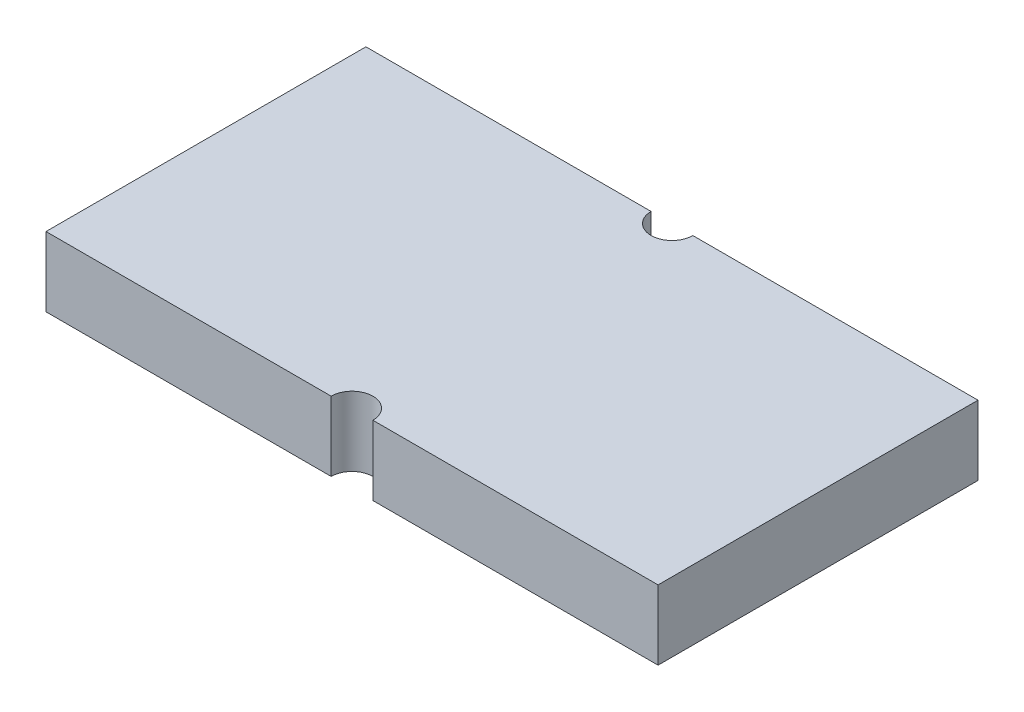
ISO-10303-21;
HEADER;
FILE_DESCRIPTION(('STEP AP214'),'2;1');
FILE_NAME('part.step','',(''),(''),'','','');
FILE_SCHEMA(('AUTOMOTIVE_DESIGN { 1 0 10303 214 1 1 1 1 }'));
ENDSEC;
DATA;
#1=APPLICATION_CONTEXT('core data for automotive mechanical design processes');
#2=APPLICATION_PROTOCOL_DEFINITION('international standard','automotive_design',2000,#1);
#3=PRODUCT_CONTEXT('',#1,'mechanical');
#4=PRODUCT('Part','Part','',(#3));
#5=PRODUCT_RELATED_PRODUCT_CATEGORY('part','',(#4));
#6=PRODUCT_DEFINITION_FORMATION('','',#4);
#7=PRODUCT_DEFINITION_CONTEXT('part definition',#1,'design');
#8=PRODUCT_DEFINITION('design','',#6,#7);
#9=PRODUCT_DEFINITION_SHAPE('','',#8);
#10=(LENGTH_UNIT() NAMED_UNIT(*) SI_UNIT(.MILLI.,.METRE.));
#11=(NAMED_UNIT(*) PLANE_ANGLE_UNIT() SI_UNIT($,.RADIAN.));
#12=(NAMED_UNIT(*) SI_UNIT($,.STERADIAN.) SOLID_ANGLE_UNIT());
#13=UNCERTAINTY_MEASURE_WITH_UNIT(LENGTH_MEASURE(1.E-05),#10,'distance_accuracy_value','');
#14=(GEOMETRIC_REPRESENTATION_CONTEXT(3) GLOBAL_UNCERTAINTY_ASSIGNED_CONTEXT((#13)) GLOBAL_UNIT_ASSIGNED_CONTEXT((#10,
#11,#12)) REPRESENTATION_CONTEXT('',''));
#15=CARTESIAN_POINT('',(0.,0.,0.));
#16=DIRECTION('',(0.,0.,1.));
#17=DIRECTION('',(1.,0.,0.));
#18=AXIS2_PLACEMENT_3D('',#15,#16,#17);
#19=CARTESIAN_POINT('',(-22.,5.,-11.5));
#20=DIRECTION('',(0.,0.,1.));
#21=DIRECTION('',(1.,0.,0.));
#22=AXIS2_PLACEMENT_3D('',#19,#20,#21);
#23=PLANE('',#22);
#24=DIRECTION('',(-1.,0.,0.));
#25=VECTOR('',#24,1.);
#26=CARTESIAN_POINT('',(-22.,0.,-11.5));
#27=LINE('',#26,#25);
#28=CARTESIAN_POINT('',(22.,0.,-11.5));
#29=VERTEX_POINT('',#28);
#30=CARTESIAN_POINT('',(1.50000000000001,0.,-11.5));
#31=VERTEX_POINT('',#30);
#32=EDGE_CURVE('E131',#29,#31,#27,.T.);
#33=ORIENTED_EDGE('',*,*,#32,.T.);
#34=DIRECTION('',(0.,1.,0.));
#35=VECTOR('',#34,1.);
#36=CARTESIAN_POINT('',(1.50000000000001,-5.,-11.5));
#37=LINE('',#36,#35);
#38=CARTESIAN_POINT('',(1.50000000000001,5.,-11.5));
#39=VERTEX_POINT('',#38);
#40=EDGE_CURVE('E50',#31,#39,#37,.T.);
#41=ORIENTED_EDGE('',*,*,#40,.T.);
#42=DIRECTION('',(-1.,0.,0.));
#43=VECTOR('',#42,1.);
#44=CARTESIAN_POINT('',(-22.,5.,-11.5));
#45=LINE('',#44,#43);
#46=CARTESIAN_POINT('',(22.,5.,-11.5));
#47=VERTEX_POINT('',#46);
#48=EDGE_CURVE('E123',#47,#39,#45,.T.);
#49=ORIENTED_EDGE('',*,*,#48,.F.);
#50=DIRECTION('',(0.,-1.,0.));
#51=VECTOR('',#50,1.);
#52=CARTESIAN_POINT('',(22.,5.,-11.5));
#53=LINE('',#52,#51);
#54=EDGE_CURVE('E148',#47,#29,#53,.T.);
#55=ORIENTED_EDGE('',*,*,#54,.T.);
#56=EDGE_LOOP('',(#33,#41,#49,#55));
#57=FACE_BOUND('',#56,.T.);
#58=ADVANCED_FACE('F36',(#57),#23,.F.);
#59=CARTESIAN_POINT('',(-22.,5.,11.5));
#60=DIRECTION('',(0.,0.,-1.));
#61=DIRECTION('',(-1.,0.,0.));
#62=AXIS2_PLACEMENT_3D('',#59,#60,#61);
#63=PLANE('',#62);
#64=DIRECTION('',(1.,0.,0.));
#65=VECTOR('',#64,1.);
#66=CARTESIAN_POINT('',(-22.,0.,11.5));
#67=LINE('',#66,#65);
#68=CARTESIAN_POINT('',(-22.,0.,11.5));
#69=VERTEX_POINT('',#68);
#70=CARTESIAN_POINT('',(-1.49999999999999,0.,11.5));
#71=VERTEX_POINT('',#70);
#72=EDGE_CURVE('E137',#69,#71,#67,.T.);
#73=ORIENTED_EDGE('',*,*,#72,.T.);
#74=DIRECTION('',(0.,1.,0.));
#75=VECTOR('',#74,1.);
#76=CARTESIAN_POINT('',(-1.49999999999999,-5.,11.5));
#77=LINE('',#76,#75);
#78=CARTESIAN_POINT('',(-1.49999999999999,5.,11.5));
#79=VERTEX_POINT('',#78);
#80=EDGE_CURVE('E58',#71,#79,#77,.T.);
#81=ORIENTED_EDGE('',*,*,#80,.T.);
#82=DIRECTION('',(1.,0.,0.));
#83=VECTOR('',#82,1.);
#84=CARTESIAN_POINT('',(-22.,5.,11.5));
#85=LINE('',#84,#83);
#86=CARTESIAN_POINT('',(-22.,5.,11.5));
#87=VERTEX_POINT('',#86);
#88=EDGE_CURVE('E115',#87,#79,#85,.T.);
#89=ORIENTED_EDGE('',*,*,#88,.F.);
#90=DIRECTION('',(0.,-1.,0.));
#91=VECTOR('',#90,1.);
#92=CARTESIAN_POINT('',(-22.,5.,11.5));
#93=LINE('',#92,#91);
#94=EDGE_CURVE('E142',#87,#69,#93,.T.);
#95=ORIENTED_EDGE('',*,*,#94,.T.);
#96=EDGE_LOOP('',(#73,#81,#89,#95));
#97=FACE_BOUND('',#96,.T.);
#98=ADVANCED_FACE('F177',(#97),#63,.F.);
#99=CARTESIAN_POINT('',(22.,5.,11.5));
#100=DIRECTION('',(-1.,0.,0.));
#101=DIRECTION('',(0.,0.,1.));
#102=AXIS2_PLACEMENT_3D('',#99,#100,#101);
#103=PLANE('',#102);
#104=DIRECTION('',(0.,0.,-1.));
#105=VECTOR('',#104,1.);
#106=CARTESIAN_POINT('',(22.,0.,11.5));
#107=LINE('',#106,#105);
#108=CARTESIAN_POINT('',(22.,0.,11.5));
#109=VERTEX_POINT('',#108);
#110=EDGE_CURVE('E127',#109,#29,#107,.T.);
#111=ORIENTED_EDGE('',*,*,#110,.T.);
#112=ORIENTED_EDGE('',*,*,#54,.F.);
#113=DIRECTION('',(0.,0.,-1.));
#114=VECTOR('',#113,1.);
#115=CARTESIAN_POINT('',(22.,5.,11.5));
#116=LINE('',#115,#114);
#117=CARTESIAN_POINT('',(22.,5.,11.5));
#118=VERTEX_POINT('',#117);
#119=EDGE_CURVE('E140',#118,#47,#116,.T.);
#120=ORIENTED_EDGE('',*,*,#119,.F.);
#121=DIRECTION('',(0.,-1.,0.));
#122=VECTOR('',#121,1.);
#123=CARTESIAN_POINT('',(22.,5.,11.5));
#124=LINE('',#123,#122);
#125=EDGE_CURVE('E119',#118,#109,#124,.T.);
#126=ORIENTED_EDGE('',*,*,#125,.T.);
#127=EDGE_LOOP('',(#111,#112,#120,#126));
#128=FACE_BOUND('',#127,.T.);
#129=ADVANCED_FACE('F38',(#128),#103,.F.);
#130=CARTESIAN_POINT('',(-1.49999999999999,5.,-11.5));
#131=VERTEX_POINT('',#130);
#132=CARTESIAN_POINT('',(-22.,5.,-11.5));
#133=VERTEX_POINT('',#132);
#134=EDGE_CURVE('E166',#131,#133,#45,.T.);
#135=ORIENTED_EDGE('',*,*,#134,.F.);
#136=DIRECTION('',(0.,1.,0.));
#137=VECTOR('',#136,1.);
#138=CARTESIAN_POINT('',(-1.49999999999999,-5.,-11.5));
#139=LINE('',#138,#137);
#140=CARTESIAN_POINT('',(-1.49999999999999,0.,-11.5));
#141=VERTEX_POINT('',#140);
#142=EDGE_CURVE('E160',#131,#141,#139,.F.);
#143=ORIENTED_EDGE('',*,*,#142,.T.);
#144=CARTESIAN_POINT('',(-22.,0.,-11.5));
#145=VERTEX_POINT('',#144);
#146=EDGE_CURVE('E130',#141,#145,#27,.T.);
#147=ORIENTED_EDGE('',*,*,#146,.T.);
#148=DIRECTION('',(0.,-1.,0.));
#149=VECTOR('',#148,1.);
#150=CARTESIAN_POINT('',(-22.,5.,-11.5));
#151=LINE('',#150,#149);
#152=EDGE_CURVE('E145',#133,#145,#151,.T.);
#153=ORIENTED_EDGE('',*,*,#152,.F.);
#154=EDGE_LOOP('',(#135,#143,#147,#153));
#155=FACE_BOUND('',#154,.T.);
#156=ADVANCED_FACE('F164',(#155),#23,.F.);
#157=CARTESIAN_POINT('',(-22.,5.,11.5));
#158=DIRECTION('',(1.,0.,0.));
#159=DIRECTION('',(0.,0.,-1.));
#160=AXIS2_PLACEMENT_3D('',#157,#158,#159);
#161=PLANE('',#160);
#162=DIRECTION('',(0.,0.,1.));
#163=VECTOR('',#162,1.);
#164=CARTESIAN_POINT('',(-22.,0.,11.5));
#165=LINE('',#164,#163);
#166=EDGE_CURVE('E134',#145,#69,#165,.T.);
#167=ORIENTED_EDGE('',*,*,#166,.T.);
#168=ORIENTED_EDGE('',*,*,#94,.F.);
#169=DIRECTION('',(0.,0.,1.));
#170=VECTOR('',#169,1.);
#171=CARTESIAN_POINT('',(-22.,5.,11.5));
#172=LINE('',#171,#170);
#173=EDGE_CURVE('E121',#133,#87,#172,.T.);
#174=ORIENTED_EDGE('',*,*,#173,.F.);
#175=ORIENTED_EDGE('',*,*,#152,.T.);
#176=EDGE_LOOP('',(#167,#168,#174,#175));
#177=FACE_BOUND('',#176,.T.);
#178=ADVANCED_FACE('F174',(#177),#161,.F.);
#179=CARTESIAN_POINT('',(1.50000000000001,5.,11.5));
#180=VERTEX_POINT('',#179);
#181=EDGE_CURVE('E112',#180,#118,#85,.T.);
#182=ORIENTED_EDGE('',*,*,#181,.F.);
#183=DIRECTION('',(0.,1.,0.));
#184=VECTOR('',#183,1.);
#185=CARTESIAN_POINT('',(1.50000000000001,-5.,11.5));
#186=LINE('',#185,#184);
#187=CARTESIAN_POINT('',(1.50000000000001,0.,11.5));
#188=VERTEX_POINT('',#187);
#189=EDGE_CURVE('E98',#180,#188,#186,.F.);
#190=ORIENTED_EDGE('',*,*,#189,.T.);
#191=EDGE_CURVE('E136',#188,#109,#67,.T.);
#192=ORIENTED_EDGE('',*,*,#191,.T.);
#193=ORIENTED_EDGE('',*,*,#125,.F.);
#194=EDGE_LOOP('',(#182,#190,#192,#193));
#195=FACE_BOUND('',#194,.T.);
#196=ADVANCED_FACE('F117',(#195),#63,.F.);
#197=CARTESIAN_POINT('',(0.,5.,0.));
#198=DIRECTION('',(0.,-1.,0.));
#199=DIRECTION('',(0.,0.,-1.));
#200=AXIS2_PLACEMENT_3D('',#197,#198,#199);
#201=PLANE('',#200);
#202=ORIENTED_EDGE('',*,*,#48,.T.);
#203=CARTESIAN_POINT('',(0.,5.,-11.5));
#204=DIRECTION('',(0.,1.,0.));
#205=DIRECTION('',(0.,0.,1.));
#206=AXIS2_PLACEMENT_3D('',#203,#204,#205);
#207=CIRCLE('',#206,1.5);
#208=EDGE_CURVE('E105',#131,#39,#207,.T.);
#209=ORIENTED_EDGE('',*,*,#208,.F.);
#210=ORIENTED_EDGE('',*,*,#134,.T.);
#211=ORIENTED_EDGE('',*,*,#173,.T.);
#212=ORIENTED_EDGE('',*,*,#88,.T.);
#213=CARTESIAN_POINT('',(0.,5.,11.5));
#214=DIRECTION('',(0.,1.,0.));
#215=DIRECTION('',(0.,0.,1.));
#216=AXIS2_PLACEMENT_3D('',#213,#214,#215);
#217=CIRCLE('',#216,1.5);
#218=EDGE_CURVE('E101',#180,#79,#217,.T.);
#219=ORIENTED_EDGE('',*,*,#218,.F.);
#220=ORIENTED_EDGE('',*,*,#181,.T.);
#221=ORIENTED_EDGE('',*,*,#119,.T.);
#222=EDGE_LOOP('',(#202,#209,#210,#211,#212,#219,#220,#221));
#223=FACE_BOUND('',#222,.T.);
#224=ADVANCED_FACE('F110',(#223),#201,.F.);
#225=CARTESIAN_POINT('',(0.,0.,0.));
#226=DIRECTION('',(0.,-1.,0.));
#227=DIRECTION('',(0.,0.,-1.));
#228=AXIS2_PLACEMENT_3D('',#225,#226,#227);
#229=PLANE('',#228);
#230=CARTESIAN_POINT('',(0.,0.,-11.5));
#231=DIRECTION('',(0.,-1.,0.));
#232=DIRECTION('',(0.,0.,-1.));
#233=AXIS2_PLACEMENT_3D('',#230,#231,#232);
#234=CIRCLE('',#233,1.5);
#235=EDGE_CURVE('E11',#31,#141,#234,.T.);
#236=ORIENTED_EDGE('',*,*,#235,.F.);
#237=ORIENTED_EDGE('',*,*,#32,.F.);
#238=ORIENTED_EDGE('',*,*,#110,.F.);
#239=ORIENTED_EDGE('',*,*,#191,.F.);
#240=CARTESIAN_POINT('',(0.,0.,11.5));
#241=DIRECTION('',(0.,-1.,0.));
#242=DIRECTION('',(0.,0.,-1.));
#243=AXIS2_PLACEMENT_3D('',#240,#241,#242);
#244=CIRCLE('',#243,1.5);
#245=EDGE_CURVE('E44',#71,#188,#244,.T.);
#246=ORIENTED_EDGE('',*,*,#245,.F.);
#247=ORIENTED_EDGE('',*,*,#72,.F.);
#248=ORIENTED_EDGE('',*,*,#166,.F.);
#249=ORIENTED_EDGE('',*,*,#146,.F.);
#250=EDGE_LOOP('',(#236,#237,#238,#239,#246,#247,#248,#249));
#251=FACE_BOUND('',#250,.T.);
#252=ADVANCED_FACE('F155',(#251),#229,.T.);
#253=CARTESIAN_POINT('',(0.,-5.,11.5));
#254=DIRECTION('',(0.,1.,0.));
#255=DIRECTION('',(0.,0.,1.));
#256=AXIS2_PLACEMENT_3D('',#253,#254,#255);
#257=CYLINDRICAL_SURFACE('',#256,1.5);
#258=ORIENTED_EDGE('',*,*,#245,.T.);
#259=ORIENTED_EDGE('',*,*,#189,.F.);
#260=ORIENTED_EDGE('',*,*,#218,.T.);
#261=ORIENTED_EDGE('',*,*,#80,.F.);
#262=EDGE_LOOP('',(#258,#259,#260,#261));
#263=FACE_BOUND('',#262,.T.);
#264=ADVANCED_FACE('F100',(#263),#257,.F.);
#265=CARTESIAN_POINT('',(0.,-5.,-11.5));
#266=DIRECTION('',(0.,1.,0.));
#267=DIRECTION('',(0.,0.,1.));
#268=AXIS2_PLACEMENT_3D('',#265,#266,#267);
#269=CYLINDRICAL_SURFACE('',#268,1.5);
#270=ORIENTED_EDGE('',*,*,#235,.T.);
#271=ORIENTED_EDGE('',*,*,#142,.F.);
#272=ORIENTED_EDGE('',*,*,#208,.T.);
#273=ORIENTED_EDGE('',*,*,#40,.F.);
#274=EDGE_LOOP('',(#270,#271,#272,#273));
#275=FACE_BOUND('',#274,.T.);
#276=ADVANCED_FACE('F159',(#275),#269,.F.);
#277=CLOSED_SHELL('',(#58,#98,#129,#156,#178,#196,#224,#252,#264,#276));
#278=MANIFOLD_SOLID_BREP('B2',#277);
#279=ADVANCED_BREP_SHAPE_REPRESENTATION('',(#18,#278),#14);
#280=SHAPE_DEFINITION_REPRESENTATION(#9,#279);
ENDSEC;
END-ISO-10303-21;
